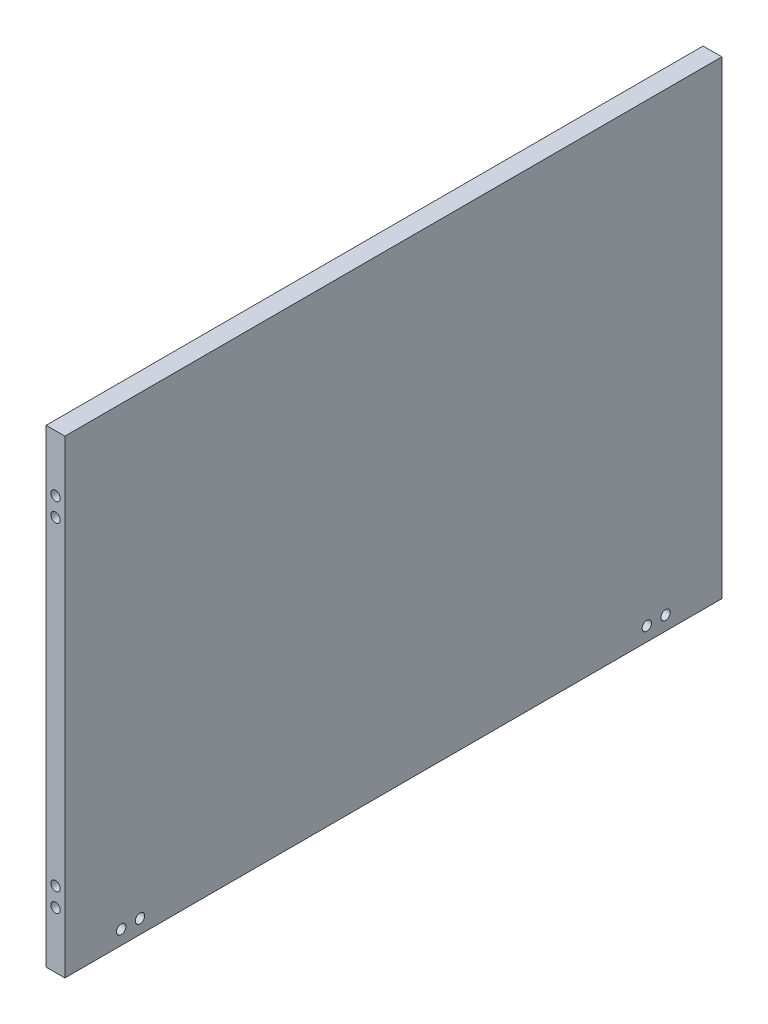
ISO-10303-21;
HEADER;
FILE_DESCRIPTION(('STEP AP214'),'2;1');
FILE_NAME('part.step','',(''),(''),'','','');
FILE_SCHEMA(('AUTOMOTIVE_DESIGN { 1 0 10303 214 1 1 1 1 }'));
ENDSEC;
DATA;
#1=APPLICATION_CONTEXT('core data for automotive mechanical design processes');
#2=APPLICATION_PROTOCOL_DEFINITION('international standard','automotive_design',2000,#1);
#3=PRODUCT_CONTEXT('',#1,'mechanical');
#4=PRODUCT('Part','Part','',(#3));
#5=PRODUCT_RELATED_PRODUCT_CATEGORY('part','',(#4));
#6=PRODUCT_DEFINITION_FORMATION('','',#4);
#7=PRODUCT_DEFINITION_CONTEXT('part definition',#1,'design');
#8=PRODUCT_DEFINITION('design','',#6,#7);
#9=PRODUCT_DEFINITION_SHAPE('','',#8);
#10=(LENGTH_UNIT() NAMED_UNIT(*) SI_UNIT(.MILLI.,.METRE.));
#11=(NAMED_UNIT(*) PLANE_ANGLE_UNIT() SI_UNIT($,.RADIAN.));
#12=(NAMED_UNIT(*) SI_UNIT($,.STERADIAN.) SOLID_ANGLE_UNIT());
#13=UNCERTAINTY_MEASURE_WITH_UNIT(LENGTH_MEASURE(1.E-05),#10,'distance_accuracy_value','');
#14=(GEOMETRIC_REPRESENTATION_CONTEXT(3) GLOBAL_UNCERTAINTY_ASSIGNED_CONTEXT((#13)) GLOBAL_UNIT_ASSIGNED_CONTEXT((#10,
#11,#12)) REPRESENTATION_CONTEXT('',''));
#15=CARTESIAN_POINT('',(0.,0.,0.));
#16=DIRECTION('',(0.,0.,1.));
#17=DIRECTION('',(1.,0.,0.));
#18=AXIS2_PLACEMENT_3D('',#15,#16,#17);
#19=CARTESIAN_POINT('',(10.,125.,-175.));
#20=DIRECTION('',(0.,0.,1.));
#21=DIRECTION('',(0.,-1.,0.));
#22=AXIS2_PLACEMENT_3D('',#19,#20,#21);
#23=PLANE('',#22);
#24=CARTESIAN_POINT('',(5.,95.,-175.));
#25=DIRECTION('',(0.,0.,1.));
#26=DIRECTION('',(1.,0.,0.));
#27=AXIS2_PLACEMENT_3D('',#24,#25,#26);
#28=CIRCLE('',#27,2.5);
#29=CARTESIAN_POINT('',(7.5,95.,-175.));
#30=VERTEX_POINT('',#29);
#31=EDGE_CURVE('E158',#30,#30,#28,.T.);
#32=ORIENTED_EDGE('',*,*,#31,.T.);
#33=EDGE_LOOP('',(#32));
#34=FACE_BOUND('',#33,.T.);
#35=CARTESIAN_POINT('',(5.,85.,-175.));
#36=DIRECTION('',(0.,0.,1.));
#37=DIRECTION('',(1.,0.,0.));
#38=AXIS2_PLACEMENT_3D('',#35,#36,#37);
#39=CIRCLE('',#38,2.5);
#40=CARTESIAN_POINT('',(7.5,85.,-175.));
#41=VERTEX_POINT('',#40);
#42=EDGE_CURVE('E152',#41,#41,#39,.T.);
#43=ORIENTED_EDGE('',*,*,#42,.T.);
#44=EDGE_LOOP('',(#43));
#45=FACE_BOUND('',#44,.T.);
#46=CARTESIAN_POINT('',(5.,-85.,-175.));
#47=DIRECTION('',(0.,0.,1.));
#48=DIRECTION('',(1.,0.,0.));
#49=AXIS2_PLACEMENT_3D('',#46,#47,#48);
#50=CIRCLE('',#49,2.5);
#51=CARTESIAN_POINT('',(7.5,-85.,-175.));
#52=VERTEX_POINT('',#51);
#53=EDGE_CURVE('E146',#52,#52,#50,.T.);
#54=ORIENTED_EDGE('',*,*,#53,.T.);
#55=EDGE_LOOP('',(#54));
#56=FACE_BOUND('',#55,.T.);
#57=CARTESIAN_POINT('',(5.,-95.,-175.));
#58=DIRECTION('',(0.,0.,1.));
#59=DIRECTION('',(1.,0.,0.));
#60=AXIS2_PLACEMENT_3D('',#57,#58,#59);
#61=CIRCLE('',#60,2.5);
#62=CARTESIAN_POINT('',(7.5,-95.,-175.));
#63=VERTEX_POINT('',#62);
#64=EDGE_CURVE('E139',#63,#63,#61,.T.);
#65=ORIENTED_EDGE('',*,*,#64,.T.);
#66=EDGE_LOOP('',(#65));
#67=FACE_BOUND('',#66,.T.);
#68=DIRECTION('',(0.,1.,0.));
#69=VECTOR('',#68,1.);
#70=CARTESIAN_POINT('',(0.,125.,-175.));
#71=LINE('',#70,#69);
#72=CARTESIAN_POINT('',(0.,-125.,-175.));
#73=VERTEX_POINT('',#72);
#74=CARTESIAN_POINT('',(0.,125.,-175.));
#75=VERTEX_POINT('',#74);
#76=EDGE_CURVE('E101',#73,#75,#71,.T.);
#77=ORIENTED_EDGE('',*,*,#76,.T.);
#78=DIRECTION('',(-1.,0.,0.));
#79=VECTOR('',#78,1.);
#80=CARTESIAN_POINT('',(10.,125.,-175.));
#81=LINE('',#80,#79);
#82=CARTESIAN_POINT('',(10.,125.,-175.));
#83=VERTEX_POINT('',#82);
#84=EDGE_CURVE('E11',#83,#75,#81,.T.);
#85=ORIENTED_EDGE('',*,*,#84,.F.);
#86=DIRECTION('',(0.,1.,0.));
#87=VECTOR('',#86,1.);
#88=CARTESIAN_POINT('',(10.,125.,-175.));
#89=LINE('',#88,#87);
#90=CARTESIAN_POINT('',(10.,-125.,-175.));
#91=VERTEX_POINT('',#90);
#92=EDGE_CURVE('E89',#91,#83,#89,.T.);
#93=ORIENTED_EDGE('',*,*,#92,.F.);
#94=DIRECTION('',(-1.,0.,0.));
#95=VECTOR('',#94,1.);
#96=CARTESIAN_POINT('',(10.,-125.,-175.));
#97=LINE('',#96,#95);
#98=EDGE_CURVE('E97',#91,#73,#97,.T.);
#99=ORIENTED_EDGE('',*,*,#98,.T.);
#100=EDGE_LOOP('',(#77,#85,#93,#99));
#101=FACE_BOUND('',#100,.T.);
#102=ADVANCED_FACE('F38',(#34,#45,#56,#67,#101),#23,.F.);
#103=CARTESIAN_POINT('',(10.,125.,175.));
#104=DIRECTION('',(0.,-1.,0.));
#105=DIRECTION('',(0.,0.,-1.));
#106=AXIS2_PLACEMENT_3D('',#103,#104,#105);
#107=PLANE('',#106);
#108=DIRECTION('',(0.,0.,1.));
#109=VECTOR('',#108,1.);
#110=CARTESIAN_POINT('',(0.,125.,175.));
#111=LINE('',#110,#109);
#112=CARTESIAN_POINT('',(0.,125.,175.));
#113=VERTEX_POINT('',#112);
#114=EDGE_CURVE('E93',#75,#113,#111,.T.);
#115=ORIENTED_EDGE('',*,*,#114,.T.);
#116=DIRECTION('',(-1.,0.,0.));
#117=VECTOR('',#116,1.);
#118=CARTESIAN_POINT('',(10.,125.,175.));
#119=LINE('',#118,#117);
#120=CARTESIAN_POINT('',(10.,125.,175.));
#121=VERTEX_POINT('',#120);
#122=EDGE_CURVE('E46',#121,#113,#119,.T.);
#123=ORIENTED_EDGE('',*,*,#122,.F.);
#124=DIRECTION('',(0.,0.,1.));
#125=VECTOR('',#124,1.);
#126=CARTESIAN_POINT('',(10.,125.,175.));
#127=LINE('',#126,#125);
#128=EDGE_CURVE('E84',#83,#121,#127,.T.);
#129=ORIENTED_EDGE('',*,*,#128,.F.);
#130=ORIENTED_EDGE('',*,*,#84,.T.);
#131=EDGE_LOOP('',(#115,#123,#129,#130));
#132=FACE_BOUND('',#131,.T.);
#133=ADVANCED_FACE('F92',(#132),#107,.F.);
#134=CARTESIAN_POINT('',(10.,125.,175.));
#135=DIRECTION('',(0.,0.,-1.));
#136=DIRECTION('',(0.,1.,0.));
#137=AXIS2_PLACEMENT_3D('',#134,#135,#136);
#138=PLANE('',#137);
#139=CARTESIAN_POINT('',(5.,95.,175.));
#140=DIRECTION('',(0.,0.,1.));
#141=DIRECTION('',(1.,0.,0.));
#142=AXIS2_PLACEMENT_3D('',#139,#140,#141);
#143=CIRCLE('',#142,2.5);
#144=CARTESIAN_POINT('',(7.5,95.,175.));
#145=VERTEX_POINT('',#144);
#146=EDGE_CURVE('E134',#145,#145,#143,.T.);
#147=ORIENTED_EDGE('',*,*,#146,.F.);
#148=EDGE_LOOP('',(#147));
#149=FACE_BOUND('',#148,.T.);
#150=CARTESIAN_POINT('',(5.,85.,175.));
#151=DIRECTION('',(0.,0.,1.));
#152=DIRECTION('',(1.,0.,0.));
#153=AXIS2_PLACEMENT_3D('',#150,#151,#152);
#154=CIRCLE('',#153,2.5);
#155=CARTESIAN_POINT('',(7.5,85.,175.));
#156=VERTEX_POINT('',#155);
#157=EDGE_CURVE('E128',#156,#156,#154,.T.);
#158=ORIENTED_EDGE('',*,*,#157,.F.);
#159=EDGE_LOOP('',(#158));
#160=FACE_BOUND('',#159,.T.);
#161=CARTESIAN_POINT('',(5.,-85.,175.));
#162=DIRECTION('',(0.,0.,1.));
#163=DIRECTION('',(1.,0.,0.));
#164=AXIS2_PLACEMENT_3D('',#161,#162,#163);
#165=CIRCLE('',#164,2.5);
#166=CARTESIAN_POINT('',(7.5,-85.,175.));
#167=VERTEX_POINT('',#166);
#168=EDGE_CURVE('E122',#167,#167,#165,.T.);
#169=ORIENTED_EDGE('',*,*,#168,.F.);
#170=EDGE_LOOP('',(#169));
#171=FACE_BOUND('',#170,.T.);
#172=CARTESIAN_POINT('',(5.,-95.,175.));
#173=DIRECTION('',(0.,0.,1.));
#174=DIRECTION('',(1.,0.,0.));
#175=AXIS2_PLACEMENT_3D('',#172,#173,#174);
#176=CIRCLE('',#175,2.5);
#177=CARTESIAN_POINT('',(7.5,-95.,175.));
#178=VERTEX_POINT('',#177);
#179=EDGE_CURVE('E115',#178,#178,#176,.T.);
#180=ORIENTED_EDGE('',*,*,#179,.F.);
#181=EDGE_LOOP('',(#180));
#182=FACE_BOUND('',#181,.T.);
#183=DIRECTION('',(0.,-1.,0.));
#184=VECTOR('',#183,1.);
#185=CARTESIAN_POINT('',(0.,125.,175.));
#186=LINE('',#185,#184);
#187=CARTESIAN_POINT('',(0.,-125.,175.));
#188=VERTEX_POINT('',#187);
#189=EDGE_CURVE('E71',#113,#188,#186,.T.);
#190=ORIENTED_EDGE('',*,*,#189,.T.);
#191=DIRECTION('',(-1.,0.,0.));
#192=VECTOR('',#191,1.);
#193=CARTESIAN_POINT('',(10.,-125.,175.));
#194=LINE('',#193,#192);
#195=CARTESIAN_POINT('',(10.,-125.,175.));
#196=VERTEX_POINT('',#195);
#197=EDGE_CURVE('E94',#196,#188,#194,.T.);
#198=ORIENTED_EDGE('',*,*,#197,.F.);
#199=DIRECTION('',(0.,-1.,0.));
#200=VECTOR('',#199,1.);
#201=CARTESIAN_POINT('',(10.,125.,175.));
#202=LINE('',#201,#200);
#203=EDGE_CURVE('E87',#121,#196,#202,.T.);
#204=ORIENTED_EDGE('',*,*,#203,.F.);
#205=ORIENTED_EDGE('',*,*,#122,.T.);
#206=EDGE_LOOP('',(#190,#198,#204,#205));
#207=FACE_BOUND('',#206,.T.);
#208=ADVANCED_FACE('F95',(#149,#160,#171,#182,#207),#138,.F.);
#209=CARTESIAN_POINT('',(10.,-125.,175.));
#210=DIRECTION('',(0.,1.,0.));
#211=DIRECTION('',(0.,0.,1.));
#212=AXIS2_PLACEMENT_3D('',#209,#210,#211);
#213=PLANE('',#212);
#214=DIRECTION('',(0.,0.,-1.));
#215=VECTOR('',#214,1.);
#216=CARTESIAN_POINT('',(0.,-125.,175.));
#217=LINE('',#216,#215);
#218=EDGE_CURVE('E77',#188,#73,#217,.T.);
#219=ORIENTED_EDGE('',*,*,#218,.T.);
#220=ORIENTED_EDGE('',*,*,#98,.F.);
#221=DIRECTION('',(0.,0.,-1.));
#222=VECTOR('',#221,1.);
#223=CARTESIAN_POINT('',(10.,-125.,175.));
#224=LINE('',#223,#222);
#225=EDGE_CURVE('E54',#196,#91,#224,.T.);
#226=ORIENTED_EDGE('',*,*,#225,.F.);
#227=ORIENTED_EDGE('',*,*,#197,.T.);
#228=EDGE_LOOP('',(#219,#220,#226,#227));
#229=FACE_BOUND('',#228,.T.);
#230=ADVANCED_FACE('F109',(#229),#213,.F.);
#231=CARTESIAN_POINT('',(10.,0.,0.));
#232=DIRECTION('',(1.,0.,0.));
#233=DIRECTION('',(0.,0.,-1.));
#234=AXIS2_PLACEMENT_3D('',#231,#232,#233);
#235=PLANE('',#234);
#236=CARTESIAN_POINT('',(10.,-117.5,145.));
#237=DIRECTION('',(1.,0.,0.));
#238=DIRECTION('',(0.,0.,-1.));
#239=AXIS2_PLACEMENT_3D('',#236,#237,#238);
#240=CIRCLE('',#239,2.5);
#241=CARTESIAN_POINT('',(10.,-117.5,142.5));
#242=VERTEX_POINT('',#241);
#243=EDGE_CURVE('E181',#242,#242,#240,.T.);
#244=ORIENTED_EDGE('',*,*,#243,.F.);
#245=EDGE_LOOP('',(#244));
#246=FACE_BOUND('',#245,.T.);
#247=CARTESIAN_POINT('',(10.,-117.5,135.));
#248=DIRECTION('',(1.,0.,0.));
#249=DIRECTION('',(0.,0.,-1.));
#250=AXIS2_PLACEMENT_3D('',#247,#248,#249);
#251=CIRCLE('',#250,2.5);
#252=CARTESIAN_POINT('',(10.,-117.5,132.5));
#253=VERTEX_POINT('',#252);
#254=EDGE_CURVE('E175',#253,#253,#251,.T.);
#255=ORIENTED_EDGE('',*,*,#254,.F.);
#256=EDGE_LOOP('',(#255));
#257=FACE_BOUND('',#256,.T.);
#258=CARTESIAN_POINT('',(10.,-117.5,-135.));
#259=DIRECTION('',(1.,0.,0.));
#260=DIRECTION('',(0.,0.,-1.));
#261=AXIS2_PLACEMENT_3D('',#258,#259,#260);
#262=CIRCLE('',#261,2.5);
#263=CARTESIAN_POINT('',(10.,-117.5,-137.5));
#264=VERTEX_POINT('',#263);
#265=EDGE_CURVE('E169',#264,#264,#262,.T.);
#266=ORIENTED_EDGE('',*,*,#265,.F.);
#267=EDGE_LOOP('',(#266));
#268=FACE_BOUND('',#267,.T.);
#269=CARTESIAN_POINT('',(10.,-117.5,-145.));
#270=DIRECTION('',(1.,0.,0.));
#271=DIRECTION('',(0.,0.,-1.));
#272=AXIS2_PLACEMENT_3D('',#269,#270,#271);
#273=CIRCLE('',#272,2.5);
#274=CARTESIAN_POINT('',(10.,-117.5,-147.5));
#275=VERTEX_POINT('',#274);
#276=EDGE_CURVE('E163',#275,#275,#273,.T.);
#277=ORIENTED_EDGE('',*,*,#276,.F.);
#278=EDGE_LOOP('',(#277));
#279=FACE_BOUND('',#278,.T.);
#280=ORIENTED_EDGE('',*,*,#92,.T.);
#281=ORIENTED_EDGE('',*,*,#128,.T.);
#282=ORIENTED_EDGE('',*,*,#203,.T.);
#283=ORIENTED_EDGE('',*,*,#225,.T.);
#284=EDGE_LOOP('',(#280,#281,#282,#283));
#285=FACE_BOUND('',#284,.T.);
#286=ADVANCED_FACE('F85',(#246,#257,#268,#279,#285),#235,.T.);
#287=CARTESIAN_POINT('',(0.,0.,0.));
#288=DIRECTION('',(1.,0.,0.));
#289=DIRECTION('',(0.,0.,-1.));
#290=AXIS2_PLACEMENT_3D('',#287,#288,#289);
#291=PLANE('',#290);
#292=CARTESIAN_POINT('',(0.,-117.5,145.));
#293=DIRECTION('',(1.,0.,0.));
#294=DIRECTION('',(0.,0.,-1.));
#295=AXIS2_PLACEMENT_3D('',#292,#293,#294);
#296=CIRCLE('',#295,2.5);
#297=CARTESIAN_POINT('',(0.,-117.5,142.5));
#298=VERTEX_POINT('',#297);
#299=EDGE_CURVE('E143',#298,#298,#296,.T.);
#300=ORIENTED_EDGE('',*,*,#299,.T.);
#301=EDGE_LOOP('',(#300));
#302=FACE_BOUND('',#301,.T.);
#303=CARTESIAN_POINT('',(0.,-117.5,135.));
#304=DIRECTION('',(1.,0.,0.));
#305=DIRECTION('',(0.,0.,-1.));
#306=AXIS2_PLACEMENT_3D('',#303,#304,#305);
#307=CIRCLE('',#306,2.5);
#308=CARTESIAN_POINT('',(0.,-117.5,132.5));
#309=VERTEX_POINT('',#308);
#310=EDGE_CURVE('E178',#309,#309,#307,.T.);
#311=ORIENTED_EDGE('',*,*,#310,.T.);
#312=EDGE_LOOP('',(#311));
#313=FACE_BOUND('',#312,.T.);
#314=CARTESIAN_POINT('',(0.,-117.5,-135.));
#315=DIRECTION('',(1.,0.,0.));
#316=DIRECTION('',(0.,0.,-1.));
#317=AXIS2_PLACEMENT_3D('',#314,#315,#316);
#318=CIRCLE('',#317,2.5);
#319=CARTESIAN_POINT('',(0.,-117.5,-137.5));
#320=VERTEX_POINT('',#319);
#321=EDGE_CURVE('E172',#320,#320,#318,.T.);
#322=ORIENTED_EDGE('',*,*,#321,.T.);
#323=EDGE_LOOP('',(#322));
#324=FACE_BOUND('',#323,.T.);
#325=CARTESIAN_POINT('',(0.,-117.5,-145.));
#326=DIRECTION('',(1.,0.,0.));
#327=DIRECTION('',(0.,0.,-1.));
#328=AXIS2_PLACEMENT_3D('',#325,#326,#327);
#329=CIRCLE('',#328,2.5);
#330=CARTESIAN_POINT('',(0.,-117.5,-147.5));
#331=VERTEX_POINT('',#330);
#332=EDGE_CURVE('E166',#331,#331,#329,.T.);
#333=ORIENTED_EDGE('',*,*,#332,.T.);
#334=EDGE_LOOP('',(#333));
#335=FACE_BOUND('',#334,.T.);
#336=ORIENTED_EDGE('',*,*,#76,.F.);
#337=ORIENTED_EDGE('',*,*,#218,.F.);
#338=ORIENTED_EDGE('',*,*,#189,.F.);
#339=ORIENTED_EDGE('',*,*,#114,.F.);
#340=EDGE_LOOP('',(#336,#337,#338,#339));
#341=FACE_BOUND('',#340,.T.);
#342=ADVANCED_FACE('F112',(#302,#313,#324,#335,#341),#291,.F.);
#343=CARTESIAN_POINT('',(5.,-95.,165.));
#344=DIRECTION('',(0.,0.,1.));
#345=DIRECTION('',(1.,0.,0.));
#346=AXIS2_PLACEMENT_3D('',#343,#344,#345);
#347=CYLINDRICAL_SURFACE('',#346,2.5);
#348=CARTESIAN_POINT('',(5.,-95.,165.));
#349=DIRECTION('',(0.,0.,1.));
#350=DIRECTION('',(1.,0.,0.));
#351=AXIS2_PLACEMENT_3D('',#348,#349,#350);
#352=CIRCLE('',#351,2.5);
#353=CARTESIAN_POINT('',(7.5,-95.,165.));
#354=VERTEX_POINT('',#353);
#355=EDGE_CURVE('E118',#354,#354,#352,.T.);
#356=ORIENTED_EDGE('',*,*,#355,.F.);
#357=EDGE_LOOP('',(#356));
#358=FACE_BOUND('',#357,.T.);
#359=ORIENTED_EDGE('',*,*,#179,.T.);
#360=EDGE_LOOP('',(#359));
#361=FACE_BOUND('',#360,.T.);
#362=ADVANCED_FACE('F274',(#358,#361),#347,.F.);
#363=CARTESIAN_POINT('',(5.,-95.,165.));
#364=DIRECTION('',(0.,0.,1.));
#365=DIRECTION('',(1.,0.,0.));
#366=AXIS2_PLACEMENT_3D('',#363,#364,#365);
#367=PLANE('',#366);
#368=ORIENTED_EDGE('',*,*,#355,.T.);
#369=EDGE_LOOP('',(#368));
#370=FACE_BOUND('',#369,.T.);
#371=ADVANCED_FACE('F270',(#370),#367,.T.);
#372=CARTESIAN_POINT('',(5.,-85.,165.));
#373=DIRECTION('',(0.,0.,1.));
#374=DIRECTION('',(1.,0.,0.));
#375=AXIS2_PLACEMENT_3D('',#372,#373,#374);
#376=CYLINDRICAL_SURFACE('',#375,2.5);
#377=CARTESIAN_POINT('',(5.,-85.,165.));
#378=DIRECTION('',(0.,0.,1.));
#379=DIRECTION('',(1.,0.,0.));
#380=AXIS2_PLACEMENT_3D('',#377,#378,#379);
#381=CIRCLE('',#380,2.5);
#382=CARTESIAN_POINT('',(7.5,-85.,165.));
#383=VERTEX_POINT('',#382);
#384=EDGE_CURVE('E125',#383,#383,#381,.T.);
#385=ORIENTED_EDGE('',*,*,#384,.F.);
#386=EDGE_LOOP('',(#385));
#387=FACE_BOUND('',#386,.T.);
#388=ORIENTED_EDGE('',*,*,#168,.T.);
#389=EDGE_LOOP('',(#388));
#390=FACE_BOUND('',#389,.T.);
#391=ADVANCED_FACE('F266',(#387,#390),#376,.F.);
#392=CARTESIAN_POINT('',(5.,-85.,165.));
#393=DIRECTION('',(0.,0.,1.));
#394=DIRECTION('',(1.,0.,0.));
#395=AXIS2_PLACEMENT_3D('',#392,#393,#394);
#396=PLANE('',#395);
#397=ORIENTED_EDGE('',*,*,#384,.T.);
#398=EDGE_LOOP('',(#397));
#399=FACE_BOUND('',#398,.T.);
#400=ADVANCED_FACE('F262',(#399),#396,.T.);
#401=CARTESIAN_POINT('',(5.,85.,165.));
#402=DIRECTION('',(0.,0.,1.));
#403=DIRECTION('',(1.,0.,0.));
#404=AXIS2_PLACEMENT_3D('',#401,#402,#403);
#405=CYLINDRICAL_SURFACE('',#404,2.5);
#406=CARTESIAN_POINT('',(5.,85.,165.));
#407=DIRECTION('',(0.,0.,1.));
#408=DIRECTION('',(1.,0.,0.));
#409=AXIS2_PLACEMENT_3D('',#406,#407,#408);
#410=CIRCLE('',#409,2.5);
#411=CARTESIAN_POINT('',(7.5,85.,165.));
#412=VERTEX_POINT('',#411);
#413=EDGE_CURVE('E131',#412,#412,#410,.T.);
#414=ORIENTED_EDGE('',*,*,#413,.F.);
#415=EDGE_LOOP('',(#414));
#416=FACE_BOUND('',#415,.T.);
#417=ORIENTED_EDGE('',*,*,#157,.T.);
#418=EDGE_LOOP('',(#417));
#419=FACE_BOUND('',#418,.T.);
#420=ADVANCED_FACE('F258',(#416,#419),#405,.F.);
#421=CARTESIAN_POINT('',(5.,85.,165.));
#422=DIRECTION('',(0.,0.,1.));
#423=DIRECTION('',(1.,0.,0.));
#424=AXIS2_PLACEMENT_3D('',#421,#422,#423);
#425=PLANE('',#424);
#426=ORIENTED_EDGE('',*,*,#413,.T.);
#427=EDGE_LOOP('',(#426));
#428=FACE_BOUND('',#427,.T.);
#429=ADVANCED_FACE('F254',(#428),#425,.T.);
#430=CARTESIAN_POINT('',(5.,95.,165.));
#431=DIRECTION('',(0.,0.,1.));
#432=DIRECTION('',(1.,0.,0.));
#433=AXIS2_PLACEMENT_3D('',#430,#431,#432);
#434=CYLINDRICAL_SURFACE('',#433,2.5);
#435=CARTESIAN_POINT('',(5.,95.,165.));
#436=DIRECTION('',(0.,0.,1.));
#437=DIRECTION('',(1.,0.,0.));
#438=AXIS2_PLACEMENT_3D('',#435,#436,#437);
#439=CIRCLE('',#438,2.5);
#440=CARTESIAN_POINT('',(7.5,95.,165.));
#441=VERTEX_POINT('',#440);
#442=EDGE_CURVE('E104',#441,#441,#439,.T.);
#443=ORIENTED_EDGE('',*,*,#442,.F.);
#444=EDGE_LOOP('',(#443));
#445=FACE_BOUND('',#444,.T.);
#446=ORIENTED_EDGE('',*,*,#146,.T.);
#447=EDGE_LOOP('',(#446));
#448=FACE_BOUND('',#447,.T.);
#449=ADVANCED_FACE('F247',(#445,#448),#434,.F.);
#450=CARTESIAN_POINT('',(5.,95.,165.));
#451=DIRECTION('',(0.,0.,1.));
#452=DIRECTION('',(1.,0.,0.));
#453=AXIS2_PLACEMENT_3D('',#450,#451,#452);
#454=PLANE('',#453);
#455=ORIENTED_EDGE('',*,*,#442,.T.);
#456=EDGE_LOOP('',(#455));
#457=FACE_BOUND('',#456,.T.);
#458=ADVANCED_FACE('F237',(#457),#454,.T.);
#459=CARTESIAN_POINT('',(5.,-95.,-165.));
#460=DIRECTION('',(0.,0.,-1.));
#461=DIRECTION('',(-1.,0.,0.));
#462=AXIS2_PLACEMENT_3D('',#459,#460,#461);
#463=CYLINDRICAL_SURFACE('',#462,2.5);
#464=CARTESIAN_POINT('',(5.,-95.,-165.));
#465=DIRECTION('',(0.,0.,1.));
#466=DIRECTION('',(1.,0.,0.));
#467=AXIS2_PLACEMENT_3D('',#464,#465,#466);
#468=CIRCLE('',#467,2.5);
#469=CARTESIAN_POINT('',(7.5,-95.,-165.));
#470=VERTEX_POINT('',#469);
#471=EDGE_CURVE('E142',#470,#470,#468,.T.);
#472=ORIENTED_EDGE('',*,*,#471,.T.);
#473=EDGE_LOOP('',(#472));
#474=FACE_BOUND('',#473,.T.);
#475=ORIENTED_EDGE('',*,*,#64,.F.);
#476=EDGE_LOOP('',(#475));
#477=FACE_BOUND('',#476,.T.);
#478=ADVANCED_FACE('F234',(#474,#477),#463,.F.);
#479=CARTESIAN_POINT('',(5.,-95.,-165.));
#480=DIRECTION('',(0.,0.,-1.));
#481=DIRECTION('',(1.,0.,0.));
#482=AXIS2_PLACEMENT_3D('',#479,#480,#481);
#483=PLANE('',#482);
#484=ORIENTED_EDGE('',*,*,#471,.F.);
#485=EDGE_LOOP('',(#484));
#486=FACE_BOUND('',#485,.T.);
#487=ADVANCED_FACE('F236',(#486),#483,.T.);
#488=CARTESIAN_POINT('',(5.,-85.,-165.));
#489=DIRECTION('',(0.,0.,-1.));
#490=DIRECTION('',(-1.,0.,0.));
#491=AXIS2_PLACEMENT_3D('',#488,#489,#490);
#492=CYLINDRICAL_SURFACE('',#491,2.5);
#493=CARTESIAN_POINT('',(5.,-85.,-165.));
#494=DIRECTION('',(0.,0.,1.));
#495=DIRECTION('',(1.,0.,0.));
#496=AXIS2_PLACEMENT_3D('',#493,#494,#495);
#497=CIRCLE('',#496,2.5);
#498=CARTESIAN_POINT('',(7.5,-85.,-165.));
#499=VERTEX_POINT('',#498);
#500=EDGE_CURVE('E149',#499,#499,#497,.T.);
#501=ORIENTED_EDGE('',*,*,#500,.T.);
#502=EDGE_LOOP('',(#501));
#503=FACE_BOUND('',#502,.T.);
#504=ORIENTED_EDGE('',*,*,#53,.F.);
#505=EDGE_LOOP('',(#504));
#506=FACE_BOUND('',#505,.T.);
#507=ADVANCED_FACE('F244',(#503,#506),#492,.F.);
#508=CARTESIAN_POINT('',(5.,-85.,-165.));
#509=DIRECTION('',(0.,0.,-1.));
#510=DIRECTION('',(1.,0.,0.));
#511=AXIS2_PLACEMENT_3D('',#508,#509,#510);
#512=PLANE('',#511);
#513=ORIENTED_EDGE('',*,*,#500,.F.);
#514=EDGE_LOOP('',(#513));
#515=FACE_BOUND('',#514,.T.);
#516=ADVANCED_FACE('F369',(#515),#512,.T.);
#517=CARTESIAN_POINT('',(5.,85.,-165.));
#518=DIRECTION('',(0.,0.,-1.));
#519=DIRECTION('',(-1.,0.,0.));
#520=AXIS2_PLACEMENT_3D('',#517,#518,#519);
#521=CYLINDRICAL_SURFACE('',#520,2.5);
#522=CARTESIAN_POINT('',(5.,85.,-165.));
#523=DIRECTION('',(0.,0.,1.));
#524=DIRECTION('',(1.,0.,0.));
#525=AXIS2_PLACEMENT_3D('',#522,#523,#524);
#526=CIRCLE('',#525,2.5);
#527=CARTESIAN_POINT('',(7.5,85.,-165.));
#528=VERTEX_POINT('',#527);
#529=EDGE_CURVE('E155',#528,#528,#526,.T.);
#530=ORIENTED_EDGE('',*,*,#529,.T.);
#531=EDGE_LOOP('',(#530));
#532=FACE_BOUND('',#531,.T.);
#533=ORIENTED_EDGE('',*,*,#42,.F.);
#534=EDGE_LOOP('',(#533));
#535=FACE_BOUND('',#534,.T.);
#536=ADVANCED_FACE('F378',(#532,#535),#521,.F.);
#537=CARTESIAN_POINT('',(5.,85.,-165.));
#538=DIRECTION('',(0.,0.,-1.));
#539=DIRECTION('',(1.,0.,0.));
#540=AXIS2_PLACEMENT_3D('',#537,#538,#539);
#541=PLANE('',#540);
#542=ORIENTED_EDGE('',*,*,#529,.F.);
#543=EDGE_LOOP('',(#542));
#544=FACE_BOUND('',#543,.T.);
#545=ADVANCED_FACE('F388',(#544),#541,.T.);
#546=CARTESIAN_POINT('',(5.,95.,-165.));
#547=DIRECTION('',(0.,0.,-1.));
#548=DIRECTION('',(-1.,0.,0.));
#549=AXIS2_PLACEMENT_3D('',#546,#547,#548);
#550=CYLINDRICAL_SURFACE('',#549,2.5);
#551=CARTESIAN_POINT('',(5.,95.,-165.));
#552=DIRECTION('',(0.,0.,1.));
#553=DIRECTION('',(1.,0.,0.));
#554=AXIS2_PLACEMENT_3D('',#551,#552,#553);
#555=CIRCLE('',#554,2.5);
#556=CARTESIAN_POINT('',(7.5,95.,-165.));
#557=VERTEX_POINT('',#556);
#558=EDGE_CURVE('E119',#557,#557,#555,.T.);
#559=ORIENTED_EDGE('',*,*,#558,.T.);
#560=EDGE_LOOP('',(#559));
#561=FACE_BOUND('',#560,.T.);
#562=ORIENTED_EDGE('',*,*,#31,.F.);
#563=EDGE_LOOP('',(#562));
#564=FACE_BOUND('',#563,.T.);
#565=ADVANCED_FACE('F217',(#561,#564),#550,.F.);
#566=CARTESIAN_POINT('',(5.,95.,-165.));
#567=DIRECTION('',(0.,0.,-1.));
#568=DIRECTION('',(1.,0.,0.));
#569=AXIS2_PLACEMENT_3D('',#566,#567,#568);
#570=PLANE('',#569);
#571=ORIENTED_EDGE('',*,*,#558,.F.);
#572=EDGE_LOOP('',(#571));
#573=FACE_BOUND('',#572,.T.);
#574=ADVANCED_FACE('F208',(#573),#570,.T.);
#575=CARTESIAN_POINT('',(0.,-117.5,-145.));
#576=DIRECTION('',(1.,0.,0.));
#577=DIRECTION('',(0.,0.,-1.));
#578=AXIS2_PLACEMENT_3D('',#575,#576,#577);
#579=CYLINDRICAL_SURFACE('',#578,2.5);
#580=ORIENTED_EDGE('',*,*,#332,.F.);
#581=EDGE_LOOP('',(#580));
#582=FACE_BOUND('',#581,.T.);
#583=ORIENTED_EDGE('',*,*,#276,.T.);
#584=EDGE_LOOP('',(#583));
#585=FACE_BOUND('',#584,.T.);
#586=ADVANCED_FACE('F205',(#582,#585),#579,.F.);
#587=CARTESIAN_POINT('',(0.,-117.5,-135.));
#588=DIRECTION('',(1.,0.,0.));
#589=DIRECTION('',(0.,0.,-1.));
#590=AXIS2_PLACEMENT_3D('',#587,#588,#589);
#591=CYLINDRICAL_SURFACE('',#590,2.5);
#592=ORIENTED_EDGE('',*,*,#321,.F.);
#593=EDGE_LOOP('',(#592));
#594=FACE_BOUND('',#593,.T.);
#595=ORIENTED_EDGE('',*,*,#265,.T.);
#596=EDGE_LOOP('',(#595));
#597=FACE_BOUND('',#596,.T.);
#598=ADVANCED_FACE('F207',(#594,#597),#591,.F.);
#599=CARTESIAN_POINT('',(0.,-117.5,135.));
#600=DIRECTION('',(1.,0.,0.));
#601=DIRECTION('',(0.,0.,-1.));
#602=AXIS2_PLACEMENT_3D('',#599,#600,#601);
#603=CYLINDRICAL_SURFACE('',#602,2.5);
#604=ORIENTED_EDGE('',*,*,#310,.F.);
#605=EDGE_LOOP('',(#604));
#606=FACE_BOUND('',#605,.T.);
#607=ORIENTED_EDGE('',*,*,#254,.T.);
#608=EDGE_LOOP('',(#607));
#609=FACE_BOUND('',#608,.T.);
#610=ADVANCED_FACE('F192',(#606,#609),#603,.F.);
#611=CARTESIAN_POINT('',(0.,-117.5,145.));
#612=DIRECTION('',(1.,0.,0.));
#613=DIRECTION('',(0.,0.,-1.));
#614=AXIS2_PLACEMENT_3D('',#611,#612,#613);
#615=CYLINDRICAL_SURFACE('',#614,2.5);
#616=ORIENTED_EDGE('',*,*,#299,.F.);
#617=EDGE_LOOP('',(#616));
#618=FACE_BOUND('',#617,.T.);
#619=ORIENTED_EDGE('',*,*,#243,.T.);
#620=EDGE_LOOP('',(#619));
#621=FACE_BOUND('',#620,.T.);
#622=ADVANCED_FACE('F189',(#618,#621),#615,.F.);
#623=CLOSED_SHELL('',(#102,#133,#208,#230,#286,#342,#362,#371,#391,#400,#420,#429,#449,#458,
#478,#487,#507,#516,#536,#545,#565,#574,#586,#598,#610,#622));
#624=MANIFOLD_SOLID_BREP('B2',#623);
#625=ADVANCED_BREP_SHAPE_REPRESENTATION('',(#18,#624),#14);
#626=SHAPE_DEFINITION_REPRESENTATION(#9,#625);
ENDSEC;
END-ISO-10303-21;
